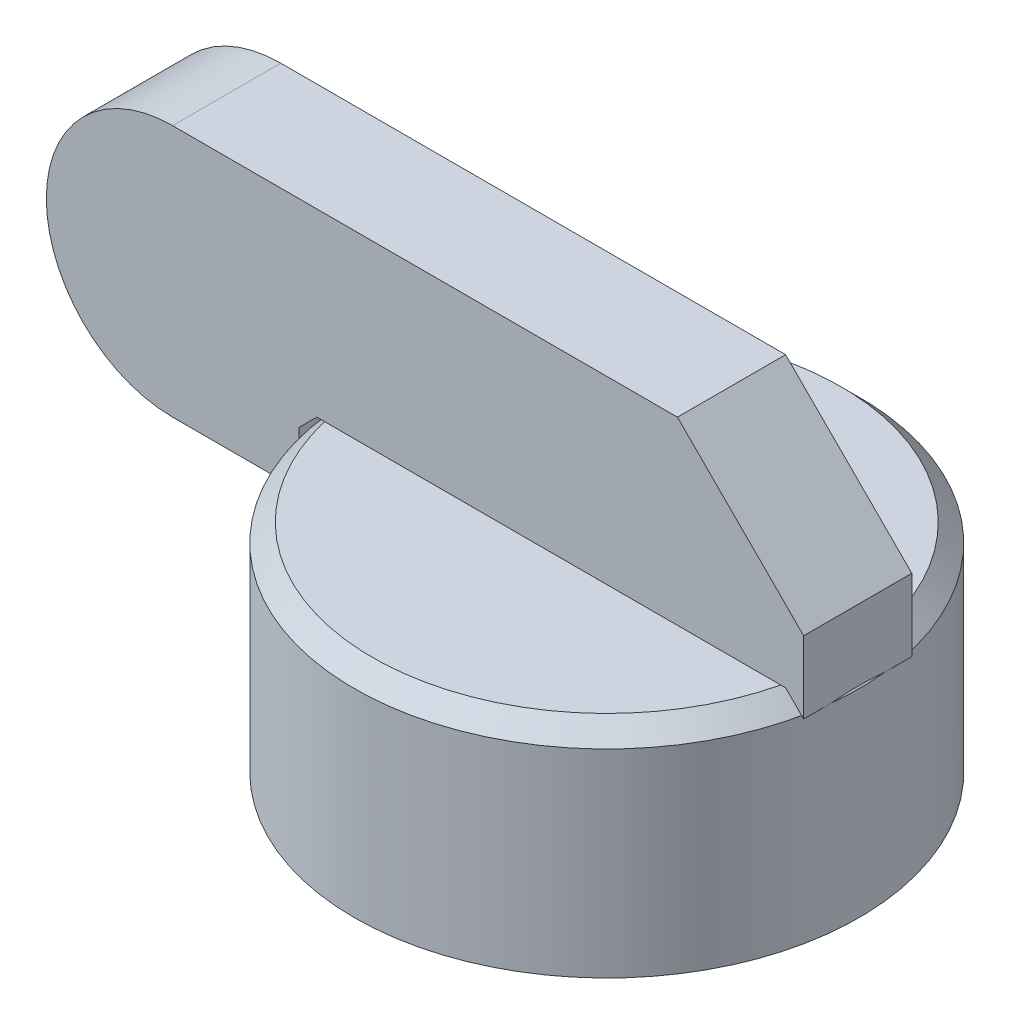
ISO-10303-21;
HEADER;
FILE_DESCRIPTION(('STEP AP214'),'2;1');
FILE_NAME('part.step','',(''),(''),'','','');
FILE_SCHEMA(('AUTOMOTIVE_DESIGN { 1 0 10303 214 1 1 1 1 }'));
ENDSEC;
DATA;
#1=APPLICATION_CONTEXT('core data for automotive mechanical design processes');
#2=APPLICATION_PROTOCOL_DEFINITION('international standard','automotive_design',2000,#1);
#3=PRODUCT_CONTEXT('',#1,'mechanical');
#4=PRODUCT('Part','Part','',(#3));
#5=PRODUCT_RELATED_PRODUCT_CATEGORY('part','',(#4));
#6=PRODUCT_DEFINITION_FORMATION('','',#4);
#7=PRODUCT_DEFINITION_CONTEXT('part definition',#1,'design');
#8=PRODUCT_DEFINITION('design','',#6,#7);
#9=PRODUCT_DEFINITION_SHAPE('','',#8);
#10=(LENGTH_UNIT() NAMED_UNIT(*) SI_UNIT(.MILLI.,.METRE.));
#11=(NAMED_UNIT(*) PLANE_ANGLE_UNIT() SI_UNIT($,.RADIAN.));
#12=(NAMED_UNIT(*) SI_UNIT($,.STERADIAN.) SOLID_ANGLE_UNIT());
#13=UNCERTAINTY_MEASURE_WITH_UNIT(LENGTH_MEASURE(1.E-05),#10,'distance_accuracy_value','');
#14=(GEOMETRIC_REPRESENTATION_CONTEXT(3) GLOBAL_UNCERTAINTY_ASSIGNED_CONTEXT((#13)) GLOBAL_UNIT_ASSIGNED_CONTEXT((#10,
#11,#12)) REPRESENTATION_CONTEXT('',''));
#15=CARTESIAN_POINT('',(0.,0.,0.));
#16=DIRECTION('',(0.,0.,1.));
#17=DIRECTION('',(1.,0.,0.));
#18=AXIS2_PLACEMENT_3D('',#15,#16,#17);
#19=CARTESIAN_POINT('',(0.,9.525,0.));
#20=DIRECTION('',(0.,1.,0.));
#21=DIRECTION('',(0.,0.,1.));
#22=AXIS2_PLACEMENT_3D('',#19,#20,#21);
#23=PLANE('',#22);
#24=CARTESIAN_POINT('',(0.,9.525,0.));
#25=DIRECTION('',(0.,1.,0.));
#26=DIRECTION('',(0.,0.,1.));
#27=AXIS2_PLACEMENT_3D('',#24,#25,#26);
#28=CIRCLE('',#27,10.31875);
#29=CARTESIAN_POINT('',(10.0402315710346,9.525,-2.38125));
#30=VERTEX_POINT('',#29);
#31=CARTESIAN_POINT('',(-10.0402315710346,9.525,-2.38125));
#32=VERTEX_POINT('',#31);
#33=EDGE_CURVE('E226',#30,#32,#28,.T.);
#34=ORIENTED_EDGE('',*,*,#33,.T.);
#35=DIRECTION('',(1.,0.,0.));
#36=VECTOR('',#35,1.);
#37=CARTESIAN_POINT('',(-10.38225,9.525,-2.38125));
#38=LINE('',#37,#36);
#39=EDGE_CURVE('E228',#32,#30,#38,.T.);
#40=ORIENTED_EDGE('',*,*,#39,.T.);
#41=EDGE_LOOP('',(#34,#40));
#42=FACE_BOUND('',#41,.T.);
#43=ADVANCED_FACE('F41',(#42),#23,.T.);
#44=CARTESIAN_POINT('',(0.,9.525,0.));
#45=DIRECTION('',(0.,-1.,0.));
#46=DIRECTION('',(0.,0.,-1.));
#47=AXIS2_PLACEMENT_3D('',#44,#45,#46);
#48=CONICAL_SURFACE('',#47,10.31875,0.785398163397447);
#49=CARTESIAN_POINT('',(0.,8.73125000000002,0.));
#50=DIRECTION('',(0.,1.,0.));
#51=DIRECTION('',(0.,0.,1.));
#52=AXIS2_PLACEMENT_3D('',#49,#50,#51);
#53=CIRCLE('',#52,11.1125);
#54=CARTESIAN_POINT('',(11.049,8.73125000000002,1.18627789745914));
#55=VERTEX_POINT('',#54);
#56=CARTESIAN_POINT('',(11.049,8.73125000000002,-1.18627789745914));
#57=VERTEX_POINT('',#56);
#58=EDGE_CURVE('E179',#55,#57,#53,.F.);
#59=ORIENTED_EDGE('',*,*,#58,.F.);
#60=CARTESIAN_POINT('',(11.0492,8.73105000000001,1.18628860316549));
#61=CARTESIAN_POINT('',(10.9168380158256,8.86341198417442,1.1792059256334));
#62=CARTESIAN_POINT('',(10.7844778573857,8.99577214261434,1.17205627735726));
#63=CARTESIAN_POINT('',(10.519761190719,9.26048880928104,1.15762303924842));
#64=CARTESIAN_POINT('',(10.3874046824922,9.39284531750778,1.15033944941444));
#65=CARTESIAN_POINT('',(10.25505,9.5252,1.14298888883514));
#66=B_SPLINE_CURVE_WITH_KNOTS('',3,(#60,#61,#62,#63,#64,#65),.UNSPECIFIED.,.F.,.F.,(4,2,4),(0.,
0.561966071035076,1.12393214740214),.UNSPECIFIED.);
#67=CARTESIAN_POINT('',(10.25525,9.525,1.14300000000021));
#68=VERTEX_POINT('',#67);
#69=EDGE_CURVE('E11',#55,#68,#66,.T.);
#70=ORIENTED_EDGE('',*,*,#69,.T.);
#71=CARTESIAN_POINT('',(10.0402315710346,9.525,2.38125));
#72=VERTEX_POINT('',#71);
#73=EDGE_CURVE('E176',#72,#68,#28,.T.);
#74=ORIENTED_EDGE('',*,*,#73,.F.);
#75=CARTESIAN_POINT('',(-10.0402315710346,9.525,2.38125));
#76=VERTEX_POINT('',#75);
#77=EDGE_CURVE('E171',#76,#72,#28,.T.);
#78=ORIENTED_EDGE('',*,*,#77,.F.);
#79=EDGE_CURVE('E69',#32,#76,#28,.T.);
#80=ORIENTED_EDGE('',*,*,#79,.F.);
#81=ORIENTED_EDGE('',*,*,#33,.F.);
#82=CARTESIAN_POINT('',(10.25525,9.525,-1.14300000000021));
#83=VERTEX_POINT('',#82);
#84=EDGE_CURVE('E180',#83,#30,#28,.T.);
#85=ORIENTED_EDGE('',*,*,#84,.F.);
#86=CARTESIAN_POINT('',(10.25505,9.5252,-1.14298888883511));
#87=CARTESIAN_POINT('',(10.3874046824922,9.39284531750778,-1.15033944941442));
#88=CARTESIAN_POINT('',(10.519761190719,9.26048880928104,-1.15762303924841));
#89=CARTESIAN_POINT('',(10.7844778573857,8.99577214261434,-1.17205627735727));
#90=CARTESIAN_POINT('',(10.9168380158256,8.86341198417442,-1.17920592563342));
#91=CARTESIAN_POINT('',(11.0492,8.73105000000001,-1.18628860316552));
#92=B_SPLINE_CURVE_WITH_KNOTS('',3,(#86,#87,#88,#89,#90,#91),.UNSPECIFIED.,.F.,.F.,(4,2,4),(0.,
0.561966076367065,1.12393214740214),.UNSPECIFIED.);
#93=EDGE_CURVE('E56',#83,#57,#92,.T.);
#94=ORIENTED_EDGE('',*,*,#93,.T.);
#95=EDGE_LOOP('',(#59,#70,#74,#78,#80,#81,#85,#94));
#96=FACE_BOUND('',#95,.T.);
#97=ADVANCED_FACE('F44',(#96),#48,.T.);
#98=EDGE_CURVE('E181',#57,#55,#53,.F.);
#99=ORIENTED_EDGE('',*,*,#98,.F.);
#100=CARTESIAN_POINT('',(11.049,6.65059458879916,-7.20964275842421));
#101=CARTESIAN_POINT('',(11.049,6.75740516081529,-7.0141605992282));
#102=CARTESIAN_POINT('',(11.049,6.86189914746052,-6.81739249126164));
#103=CARTESIAN_POINT('',(11.049,7.06558728608849,-6.42106266816805));
#104=CARTESIAN_POINT('',(11.049,7.16477987756395,-6.22150015206342));
#105=CARTESIAN_POINT('',(11.049,7.35751884628769,-5.81867225499841));
#106=CARTESIAN_POINT('',(11.049,7.45104112332854,-5.61539527906997));
#107=CARTESIAN_POINT('',(11.049,7.63116579870978,-5.20582662299815));
#108=CARTESIAN_POINT('',(11.049,7.71776872868194,-4.99953517590797));
#109=CARTESIAN_POINT('',(11.049,7.9672372433594,-4.37253811624343));
#110=CARTESIAN_POINT('',(11.049,8.11817664048953,-3.94695927502365));
#111=CARTESIAN_POINT('',(11.049,8.37974318651558,-3.084045390467));
#112=CARTESIAN_POINT('',(11.049,8.49043375404404,-2.64673001792149));
#113=CARTESIAN_POINT('',(11.049,8.64068009871255,-1.87896292461491));
#114=CARTESIAN_POINT('',(11.049,8.69129029131293,-1.55067692337253));
#115=CARTESIAN_POINT('',(11.049,8.76373975077568,-0.890862841090851));
#116=CARTESIAN_POINT('',(11.049,8.78557762908911,-0.559334604359372));
#117=CARTESIAN_POINT('',(11.049,8.7991988060901,0.102400398396171));
#118=CARTESIAN_POINT('',(11.049,8.79115770395958,0.432603503945925));
#119=CARTESIAN_POINT('',(11.049,8.74588177388135,1.09097693616075));
#120=CARTESIAN_POINT('',(11.049,8.70864500942976,1.41914712653031));
#121=CARTESIAN_POINT('',(11.049,8.59341000743408,2.15769269764207));
#122=CARTESIAN_POINT('',(11.049,8.50722113319284,2.56679011709043));
#123=CARTESIAN_POINT('',(11.049,8.29732851622712,3.37524768363746));
#124=CARTESIAN_POINT('',(11.049,8.17360396696424,3.77460229717824));
#125=CARTESIAN_POINT('',(11.049,7.89491585856813,4.56414006200642));
#126=CARTESIAN_POINT('',(11.049,7.73981237310603,4.9542730665005));
#127=CARTESIAN_POINT('',(11.049,7.40508958981073,5.72362534073242));
#128=CARTESIAN_POINT('',(11.049,7.22547787814024,6.10284794381523));
#129=CARTESIAN_POINT('',(11.049,6.97382314215821,6.60044687642883));
#130=CARTESIAN_POINT('',(11.049,6.91038831346114,6.723261457206));
#131=CARTESIAN_POINT('',(11.049,6.78179537779797,6.96742392023752));
#132=CARTESIAN_POINT('',(11.049,6.71664425714214,7.08877548030162));
#133=CARTESIAN_POINT('',(11.049,6.65059458879916,7.20964275842421));
#134=B_SPLINE_CURVE_WITH_KNOTS('',3,(#100,#101,#102,#103,#104,#105,#106,#107,#108,#109,#110,
#111,#112,#113,#114,#115,#116,#117,#118,#119,#120,#121,#122,#123,#124,#125,#126,#127,#128,#129,
#130,#131,#132,#133),.UNSPECIFIED.,.F.,.F.,(4,2,2,2,2,2,2,2,2,2,2,2,2,2,2,2,4),(0.,
0.668287786129227,1.33677121665948,2.00792113355099,2.67901943452811,4.03203874164983,
5.38291681086486,6.37827068901076,7.37367260107349,8.36323379998117,9.35286064053154,
10.6049174161535,11.8576694960091,13.1161361691086,14.3742141822128,14.7888932588484,
15.2020870287789),.UNSPECIFIED.);
#135=EDGE_CURVE('E184',#57,#55,#134,.T.);
#136=ORIENTED_EDGE('',*,*,#135,.T.);
#137=EDGE_LOOP('',(#99,#136));
#138=FACE_BOUND('',#137,.T.);
#139=ADVANCED_FACE('F214',(#138),#48,.T.);
#140=CARTESIAN_POINT('',(0.,9.525,0.));
#141=DIRECTION('',(0.,-1.,0.));
#142=DIRECTION('',(0.,0.,-1.));
#143=AXIS2_PLACEMENT_3D('',#140,#141,#142);
#144=CYLINDRICAL_SURFACE('',#143,11.1125);
#145=ORIENTED_EDGE('',*,*,#98,.T.);
#146=ORIENTED_EDGE('',*,*,#58,.T.);
#147=EDGE_LOOP('',(#145,#146));
#148=FACE_BOUND('',#147,.T.);
#149=CARTESIAN_POINT('',(0.,0.,0.));
#150=DIRECTION('',(0.,1.,0.));
#151=DIRECTION('',(0.,0.,1.));
#152=AXIS2_PLACEMENT_3D('',#149,#150,#151);
#153=CIRCLE('',#152,11.1125);
#154=CARTESIAN_POINT('',(0.,0.,11.1125));
#155=VERTEX_POINT('',#154);
#156=EDGE_CURVE('E167',#155,#155,#153,.T.);
#157=ORIENTED_EDGE('',*,*,#156,.T.);
#158=EDGE_LOOP('',(#157));
#159=FACE_BOUND('',#158,.T.);
#160=ADVANCED_FACE('F210',(#148,#159),#144,.T.);
#161=DIRECTION('',(1.,0.,0.));
#162=VECTOR('',#161,1.);
#163=CARTESIAN_POINT('',(-10.38225,9.525,2.38125));
#164=LINE('',#163,#162);
#165=EDGE_CURVE('E62',#76,#72,#164,.T.);
#166=ORIENTED_EDGE('',*,*,#165,.F.);
#167=ORIENTED_EDGE('',*,*,#77,.T.);
#168=EDGE_LOOP('',(#166,#167));
#169=FACE_BOUND('',#168,.T.);
#170=ADVANCED_FACE('F205',(#169),#23,.T.);
#171=CARTESIAN_POINT('',(0.,0.,0.));
#172=DIRECTION('',(0.,1.,0.));
#173=DIRECTION('',(0.,0.,1.));
#174=AXIS2_PLACEMENT_3D('',#171,#172,#173);
#175=PLANE('',#174);
#176=ORIENTED_EDGE('',*,*,#156,.F.);
#177=EDGE_LOOP('',(#176));
#178=FACE_BOUND('',#177,.T.);
#179=ADVANCED_FACE('F209',(#178),#175,.F.);
#180=CARTESIAN_POINT('',(10.25525,9.525,2.38125));
#181=DIRECTION('',(0.707106781186544,0.707106781186551,0.));
#182=DIRECTION('',(-0.707106781186551,0.707106781186544,0.));
#183=AXIS2_PLACEMENT_3D('',#180,#181,#182);
#184=PLANE('',#183);
#185=ORIENTED_EDGE('',*,*,#69,.F.);
#186=DIRECTION('',(0.,0.,-1.));
#187=VECTOR('',#186,1.);
#188=CARTESIAN_POINT('',(11.049,8.73125000000001,2.38125));
#189=LINE('',#188,#187);
#190=CARTESIAN_POINT('',(11.049,8.73125000000001,2.38125));
#191=VERTEX_POINT('',#190);
#192=EDGE_CURVE('E148',#191,#55,#189,.T.);
#193=ORIENTED_EDGE('',*,*,#192,.F.);
#194=DIRECTION('',(0.707106781186551,-0.707106781186544,0.));
#195=VECTOR('',#194,1.);
#196=CARTESIAN_POINT('',(10.25525,9.525,2.38125));
#197=LINE('',#196,#195);
#198=CARTESIAN_POINT('',(10.25525,9.525,2.38125));
#199=VERTEX_POINT('',#198);
#200=EDGE_CURVE('E154',#199,#191,#197,.T.);
#201=ORIENTED_EDGE('',*,*,#200,.F.);
#202=DIRECTION('',(0.,0.,-1.));
#203=VECTOR('',#202,1.);
#204=CARTESIAN_POINT('',(10.25525,9.525,2.38125));
#205=LINE('',#204,#203);
#206=EDGE_CURVE('E320',#199,#68,#205,.T.);
#207=ORIENTED_EDGE('',*,*,#206,.T.);
#208=EDGE_LOOP('',(#185,#193,#201,#207));
#209=FACE_BOUND('',#208,.T.);
#210=ADVANCED_FACE('F166',(#209),#184,.F.);
#211=CARTESIAN_POINT('',(-10.38225,9.525,2.38125));
#212=DIRECTION('',(0.,1.,0.));
#213=DIRECTION('',(0.,0.,1.));
#214=AXIS2_PLACEMENT_3D('',#211,#212,#213);
#215=PLANE('',#214);
#216=ORIENTED_EDGE('',*,*,#79,.T.);
#217=CARTESIAN_POINT('',(-10.38225,9.525,2.38125));
#218=VERTEX_POINT('',#217);
#219=EDGE_CURVE('E270',#218,#76,#164,.T.);
#220=ORIENTED_EDGE('',*,*,#219,.F.);
#221=DIRECTION('',(0.,0.,-1.));
#222=VECTOR('',#221,1.);
#223=CARTESIAN_POINT('',(-10.38225,9.525,2.38125));
#224=LINE('',#223,#222);
#225=CARTESIAN_POINT('',(-10.38225,9.525,-2.38125));
#226=VERTEX_POINT('',#225);
#227=EDGE_CURVE('E246',#218,#226,#224,.T.);
#228=ORIENTED_EDGE('',*,*,#227,.T.);
#229=EDGE_CURVE('E163',#226,#32,#38,.T.);
#230=ORIENTED_EDGE('',*,*,#229,.T.);
#231=EDGE_LOOP('',(#216,#220,#228,#230));
#232=FACE_BOUND('',#231,.T.);
#233=ADVANCED_FACE('F242',(#232),#215,.F.);
#234=ORIENTED_EDGE('',*,*,#84,.T.);
#235=CARTESIAN_POINT('',(10.25525,9.525,-2.38125));
#236=VERTEX_POINT('',#235);
#237=EDGE_CURVE('E238',#30,#236,#38,.T.);
#238=ORIENTED_EDGE('',*,*,#237,.T.);
#239=EDGE_CURVE('E272',#83,#236,#205,.T.);
#240=ORIENTED_EDGE('',*,*,#239,.F.);
#241=EDGE_LOOP('',(#234,#238,#240));
#242=FACE_BOUND('',#241,.T.);
#243=ADVANCED_FACE('F203',(#242),#215,.F.);
#244=ORIENTED_EDGE('',*,*,#93,.F.);
#245=ORIENTED_EDGE('',*,*,#239,.T.);
#246=DIRECTION('',(0.707106781186551,-0.707106781186544,0.));
#247=VECTOR('',#246,1.);
#248=CARTESIAN_POINT('',(10.25525,9.525,-2.38125));
#249=LINE('',#248,#247);
#250=CARTESIAN_POINT('',(11.049,8.73125000000001,-2.38125));
#251=VERTEX_POINT('',#250);
#252=EDGE_CURVE('E267',#236,#251,#249,.T.);
#253=ORIENTED_EDGE('',*,*,#252,.T.);
#254=EDGE_CURVE('E168',#57,#251,#189,.T.);
#255=ORIENTED_EDGE('',*,*,#254,.F.);
#256=EDGE_LOOP('',(#244,#245,#253,#255));
#257=FACE_BOUND('',#256,.T.);
#258=ADVANCED_FACE('F198',(#257),#184,.F.);
#259=CARTESIAN_POINT('',(11.049,8.73125000000001,2.38125));
#260=DIRECTION('',(-1.,0.,0.));
#261=DIRECTION('',(0.,0.,1.));
#262=AXIS2_PLACEMENT_3D('',#259,#260,#261);
#263=PLANE('',#262);
#264=ORIENTED_EDGE('',*,*,#135,.F.);
#265=ORIENTED_EDGE('',*,*,#254,.T.);
#266=DIRECTION('',(0.,1.,0.));
#267=VECTOR('',#266,1.);
#268=CARTESIAN_POINT('',(11.049,8.73125000000001,-2.38125));
#269=LINE('',#268,#267);
#270=CARTESIAN_POINT('',(11.049,11.90625,-2.38125));
#271=VERTEX_POINT('',#270);
#272=EDGE_CURVE('E265',#251,#271,#269,.T.);
#273=ORIENTED_EDGE('',*,*,#272,.T.);
#274=DIRECTION('',(0.,0.,-1.));
#275=VECTOR('',#274,1.);
#276=CARTESIAN_POINT('',(11.049,11.90625,2.38125));
#277=LINE('',#276,#275);
#278=CARTESIAN_POINT('',(11.049,11.90625,2.38125));
#279=VERTEX_POINT('',#278);
#280=EDGE_CURVE('E150',#279,#271,#277,.T.);
#281=ORIENTED_EDGE('',*,*,#280,.F.);
#282=DIRECTION('',(0.,1.,0.));
#283=VECTOR('',#282,1.);
#284=CARTESIAN_POINT('',(11.049,8.73125000000001,2.38125));
#285=LINE('',#284,#283);
#286=EDGE_CURVE('E143',#191,#279,#285,.T.);
#287=ORIENTED_EDGE('',*,*,#286,.F.);
#288=ORIENTED_EDGE('',*,*,#192,.T.);
#289=EDGE_LOOP('',(#264,#265,#273,#281,#287,#288));
#290=FACE_BOUND('',#289,.T.);
#291=ADVANCED_FACE('F146',(#290),#263,.F.);
#292=CARTESIAN_POINT('',(11.049,11.90625,2.38125));
#293=DIRECTION('',(-0.707106781186543,-0.707106781186552,0.));
#294=DIRECTION('',(0.707106781186552,-0.707106781186543,0.));
#295=AXIS2_PLACEMENT_3D('',#292,#293,#294);
#296=PLANE('',#295);
#297=DIRECTION('',(-0.707106781186552,0.707106781186543,0.));
#298=VECTOR('',#297,1.);
#299=CARTESIAN_POINT('',(11.049,11.90625,-2.38125));
#300=LINE('',#299,#298);
#301=CARTESIAN_POINT('',(5.49274999999993,17.4625,-2.38125));
#302=VERTEX_POINT('',#301);
#303=EDGE_CURVE('E263',#271,#302,#300,.T.);
#304=ORIENTED_EDGE('',*,*,#303,.T.);
#305=DIRECTION('',(0.,0.,-1.));
#306=VECTOR('',#305,1.);
#307=CARTESIAN_POINT('',(5.49274999999993,17.4625,2.38125));
#308=LINE('',#307,#306);
#309=CARTESIAN_POINT('',(5.49274999999993,17.4625,2.38125));
#310=VERTEX_POINT('',#309);
#311=EDGE_CURVE('E288',#310,#302,#308,.T.);
#312=ORIENTED_EDGE('',*,*,#311,.F.);
#313=DIRECTION('',(-0.707106781186552,0.707106781186543,0.));
#314=VECTOR('',#313,1.);
#315=CARTESIAN_POINT('',(11.049,11.90625,2.38125));
#316=LINE('',#315,#314);
#317=EDGE_CURVE('E153',#279,#310,#316,.T.);
#318=ORIENTED_EDGE('',*,*,#317,.F.);
#319=ORIENTED_EDGE('',*,*,#280,.T.);
#320=EDGE_LOOP('',(#304,#312,#318,#319));
#321=FACE_BOUND('',#320,.T.);
#322=ADVANCED_FACE('F197',(#321),#296,.F.);
#323=CARTESIAN_POINT('',(5.49274999999993,17.4625,2.38125));
#324=DIRECTION('',(0.,-1.,0.));
#325=DIRECTION('',(1.,0.,0.));
#326=AXIS2_PLACEMENT_3D('',#323,#324,#325);
#327=PLANE('',#326);
#328=DIRECTION('',(-1.,0.,0.));
#329=VECTOR('',#328,1.);
#330=CARTESIAN_POINT('',(5.49274999999993,17.4625,-2.38125));
#331=LINE('',#330,#329);
#332=CARTESIAN_POINT('',(-16.73225,17.4625,-2.38125));
#333=VERTEX_POINT('',#332);
#334=EDGE_CURVE('E261',#302,#333,#331,.T.);
#335=ORIENTED_EDGE('',*,*,#334,.T.);
#336=DIRECTION('',(0.,0.,-1.));
#337=VECTOR('',#336,1.);
#338=CARTESIAN_POINT('',(-16.73225,17.4625,2.38125));
#339=LINE('',#338,#337);
#340=CARTESIAN_POINT('',(-16.73225,17.4625,2.38125));
#341=VERTEX_POINT('',#340);
#342=EDGE_CURVE('E292',#341,#333,#339,.T.);
#343=ORIENTED_EDGE('',*,*,#342,.F.);
#344=DIRECTION('',(-1.,0.,0.));
#345=VECTOR('',#344,1.);
#346=CARTESIAN_POINT('',(5.49274999999993,17.4625,2.38125));
#347=LINE('',#346,#345);
#348=EDGE_CURVE('E281',#310,#341,#347,.T.);
#349=ORIENTED_EDGE('',*,*,#348,.F.);
#350=ORIENTED_EDGE('',*,*,#311,.T.);
#351=EDGE_LOOP('',(#335,#343,#349,#350));
#352=FACE_BOUND('',#351,.T.);
#353=ADVANCED_FACE('F293',(#352),#327,.F.);
#354=CARTESIAN_POINT('',(-16.73225,11.90625,2.38125));
#355=DIRECTION('',(0.,0.,-1.));
#356=DIRECTION('',(-1.,0.,0.));
#357=AXIS2_PLACEMENT_3D('',#354,#355,#356);
#358=CYLINDRICAL_SURFACE('',#357,5.55625);
#359=CARTESIAN_POINT('',(-16.73225,11.90625,-2.38125));
#360=DIRECTION('',(0.,0.,1.));
#361=DIRECTION('',(1.,0.,0.));
#362=AXIS2_PLACEMENT_3D('',#359,#360,#361);
#363=CIRCLE('',#362,5.55625);
#364=CARTESIAN_POINT('',(-16.73225,6.35,-2.38125));
#365=VERTEX_POINT('',#364);
#366=EDGE_CURVE('E259',#333,#365,#363,.T.);
#367=ORIENTED_EDGE('',*,*,#366,.T.);
#368=DIRECTION('',(0.,0.,-1.));
#369=VECTOR('',#368,1.);
#370=CARTESIAN_POINT('',(-16.73225,6.35,2.38125));
#371=LINE('',#370,#369);
#372=CARTESIAN_POINT('',(-16.73225,6.35,2.38125));
#373=VERTEX_POINT('',#372);
#374=EDGE_CURVE('E298',#373,#365,#371,.T.);
#375=ORIENTED_EDGE('',*,*,#374,.F.);
#376=CARTESIAN_POINT('',(-16.73225,11.90625,2.38125));
#377=DIRECTION('',(0.,0.,1.));
#378=DIRECTION('',(1.,0.,0.));
#379=AXIS2_PLACEMENT_3D('',#376,#377,#378);
#380=CIRCLE('',#379,5.55625);
#381=EDGE_CURVE('E279',#341,#373,#380,.T.);
#382=ORIENTED_EDGE('',*,*,#381,.F.);
#383=ORIENTED_EDGE('',*,*,#342,.T.);
#384=EDGE_LOOP('',(#367,#375,#382,#383));
#385=FACE_BOUND('',#384,.T.);
#386=ADVANCED_FACE('F301',(#385),#358,.T.);
#387=CARTESIAN_POINT('',(-16.73225,6.35,2.38125));
#388=DIRECTION('',(0.,1.,0.));
#389=DIRECTION('',(-1.,0.,0.));
#390=AXIS2_PLACEMENT_3D('',#387,#388,#389);
#391=PLANE('',#390);
#392=DIRECTION('',(1.,0.,0.));
#393=VECTOR('',#392,1.);
#394=CARTESIAN_POINT('',(-16.73225,6.35,-2.38125));
#395=LINE('',#394,#393);
#396=CARTESIAN_POINT('',(-11.176,6.35,-2.38125));
#397=VERTEX_POINT('',#396);
#398=EDGE_CURVE('E255',#365,#397,#395,.T.);
#399=ORIENTED_EDGE('',*,*,#398,.T.);
#400=DIRECTION('',(0.,0.,-1.));
#401=VECTOR('',#400,1.);
#402=CARTESIAN_POINT('',(-11.176,6.35,2.38125));
#403=LINE('',#402,#401);
#404=CARTESIAN_POINT('',(-11.176,6.35,2.38125));
#405=VERTEX_POINT('',#404);
#406=EDGE_CURVE('E309',#405,#397,#403,.T.);
#407=ORIENTED_EDGE('',*,*,#406,.F.);
#408=DIRECTION('',(1.,0.,0.));
#409=VECTOR('',#408,1.);
#410=CARTESIAN_POINT('',(-16.73225,6.35,2.38125));
#411=LINE('',#410,#409);
#412=EDGE_CURVE('E277',#373,#405,#411,.T.);
#413=ORIENTED_EDGE('',*,*,#412,.F.);
#414=ORIENTED_EDGE('',*,*,#374,.T.);
#415=EDGE_LOOP('',(#399,#407,#413,#414));
#416=FACE_BOUND('',#415,.T.);
#417=ADVANCED_FACE('F310',(#416),#391,.F.);
#418=CARTESIAN_POINT('',(-11.176,6.35,2.38125));
#419=DIRECTION('',(-1.,0.,0.));
#420=DIRECTION('',(0.,0.,1.));
#421=AXIS2_PLACEMENT_3D('',#418,#419,#420);
#422=PLANE('',#421);
#423=DIRECTION('',(0.,1.,0.));
#424=VECTOR('',#423,1.);
#425=CARTESIAN_POINT('',(-11.176,6.35,-2.38125));
#426=LINE('',#425,#424);
#427=CARTESIAN_POINT('',(-11.176,8.73125000000002,-2.38125));
#428=VERTEX_POINT('',#427);
#429=EDGE_CURVE('E252',#397,#428,#426,.T.);
#430=ORIENTED_EDGE('',*,*,#429,.T.);
#431=DIRECTION('',(0.,0.,-1.));
#432=VECTOR('',#431,1.);
#433=CARTESIAN_POINT('',(-11.176,8.73125000000002,2.38125));
#434=LINE('',#433,#432);
#435=CARTESIAN_POINT('',(-11.176,8.73125000000002,2.38125));
#436=VERTEX_POINT('',#435);
#437=EDGE_CURVE('E314',#436,#428,#434,.T.);
#438=ORIENTED_EDGE('',*,*,#437,.F.);
#439=DIRECTION('',(0.,1.,0.));
#440=VECTOR('',#439,1.);
#441=CARTESIAN_POINT('',(-11.176,6.35,2.38125));
#442=LINE('',#441,#440);
#443=EDGE_CURVE('E275',#405,#436,#442,.T.);
#444=ORIENTED_EDGE('',*,*,#443,.F.);
#445=ORIENTED_EDGE('',*,*,#406,.T.);
#446=EDGE_LOOP('',(#430,#438,#444,#445));
#447=FACE_BOUND('',#446,.T.);
#448=ADVANCED_FACE('F316',(#447),#422,.F.);
#449=CARTESIAN_POINT('',(-11.176,8.73125000000002,2.38125));
#450=DIRECTION('',(-0.707106781186551,0.707106781186544,0.));
#451=DIRECTION('',(-0.707106781186544,-0.707106781186551,0.));
#452=AXIS2_PLACEMENT_3D('',#449,#450,#451);
#453=PLANE('',#452);
#454=DIRECTION('',(0.707106781186544,0.707106781186551,0.));
#455=VECTOR('',#454,1.);
#456=CARTESIAN_POINT('',(-11.176,8.73125000000002,-2.38125));
#457=LINE('',#456,#455);
#458=EDGE_CURVE('E249',#428,#226,#457,.T.);
#459=ORIENTED_EDGE('',*,*,#458,.T.);
#460=ORIENTED_EDGE('',*,*,#227,.F.);
#461=DIRECTION('',(0.707106781186544,0.707106781186551,0.));
#462=VECTOR('',#461,1.);
#463=CARTESIAN_POINT('',(-11.176,8.73125000000002,2.38125));
#464=LINE('',#463,#462);
#465=EDGE_CURVE('E273',#436,#218,#464,.T.);
#466=ORIENTED_EDGE('',*,*,#465,.F.);
#467=ORIENTED_EDGE('',*,*,#437,.T.);
#468=EDGE_LOOP('',(#459,#460,#466,#467));
#469=FACE_BOUND('',#468,.T.);
#470=ADVANCED_FACE('F319',(#469),#453,.F.);
#471=ORIENTED_EDGE('',*,*,#73,.T.);
#472=ORIENTED_EDGE('',*,*,#206,.F.);
#473=EDGE_CURVE('E159',#72,#199,#164,.T.);
#474=ORIENTED_EDGE('',*,*,#473,.F.);
#475=EDGE_LOOP('',(#471,#472,#474));
#476=FACE_BOUND('',#475,.T.);
#477=ADVANCED_FACE('F331',(#476),#215,.F.);
#478=CARTESIAN_POINT('',(-16.73225,11.90625,2.38125));
#479=DIRECTION('',(0.,0.,1.));
#480=DIRECTION('',(1.,0.,0.));
#481=AXIS2_PLACEMENT_3D('',#478,#479,#480);
#482=PLANE('',#481);
#483=ORIENTED_EDGE('',*,*,#200,.T.);
#484=ORIENTED_EDGE('',*,*,#286,.T.);
#485=ORIENTED_EDGE('',*,*,#317,.T.);
#486=ORIENTED_EDGE('',*,*,#348,.T.);
#487=ORIENTED_EDGE('',*,*,#381,.T.);
#488=ORIENTED_EDGE('',*,*,#412,.T.);
#489=ORIENTED_EDGE('',*,*,#443,.T.);
#490=ORIENTED_EDGE('',*,*,#465,.T.);
#491=ORIENTED_EDGE('',*,*,#219,.T.);
#492=ORIENTED_EDGE('',*,*,#165,.T.);
#493=ORIENTED_EDGE('',*,*,#473,.T.);
#494=EDGE_LOOP('',(#483,#484,#485,#486,#487,#488,#489,#490,#491,#492,#493));
#495=FACE_BOUND('',#494,.T.);
#496=ADVANCED_FACE('F157',(#495),#482,.T.);
#497=CARTESIAN_POINT('',(-16.73225,11.90625,-2.38125));
#498=DIRECTION('',(0.,0.,1.));
#499=DIRECTION('',(1.,0.,0.));
#500=AXIS2_PLACEMENT_3D('',#497,#498,#499);
#501=PLANE('',#500);
#502=ORIENTED_EDGE('',*,*,#252,.F.);
#503=ORIENTED_EDGE('',*,*,#237,.F.);
#504=ORIENTED_EDGE('',*,*,#39,.F.);
#505=ORIENTED_EDGE('',*,*,#229,.F.);
#506=ORIENTED_EDGE('',*,*,#458,.F.);
#507=ORIENTED_EDGE('',*,*,#429,.F.);
#508=ORIENTED_EDGE('',*,*,#398,.F.);
#509=ORIENTED_EDGE('',*,*,#366,.F.);
#510=ORIENTED_EDGE('',*,*,#334,.F.);
#511=ORIENTED_EDGE('',*,*,#303,.F.);
#512=ORIENTED_EDGE('',*,*,#272,.F.);
#513=EDGE_LOOP('',(#502,#503,#504,#505,#506,#507,#508,#509,#510,#511,#512));
#514=FACE_BOUND('',#513,.T.);
#515=ADVANCED_FACE('F235',(#514),#501,.F.);
#516=CLOSED_SHELL('',(#43,#97,#139,#160,#170,#179,#210,#233,#243,#258,#291,#322,#353,#386,#417,
#448,#470,#477,#496,#515));
#517=MANIFOLD_SOLID_BREP('B2',#516);
#518=ADVANCED_BREP_SHAPE_REPRESENTATION('',(#18,#517),#14);
#519=SHAPE_DEFINITION_REPRESENTATION(#9,#518);
ENDSEC;
END-ISO-10303-21;
